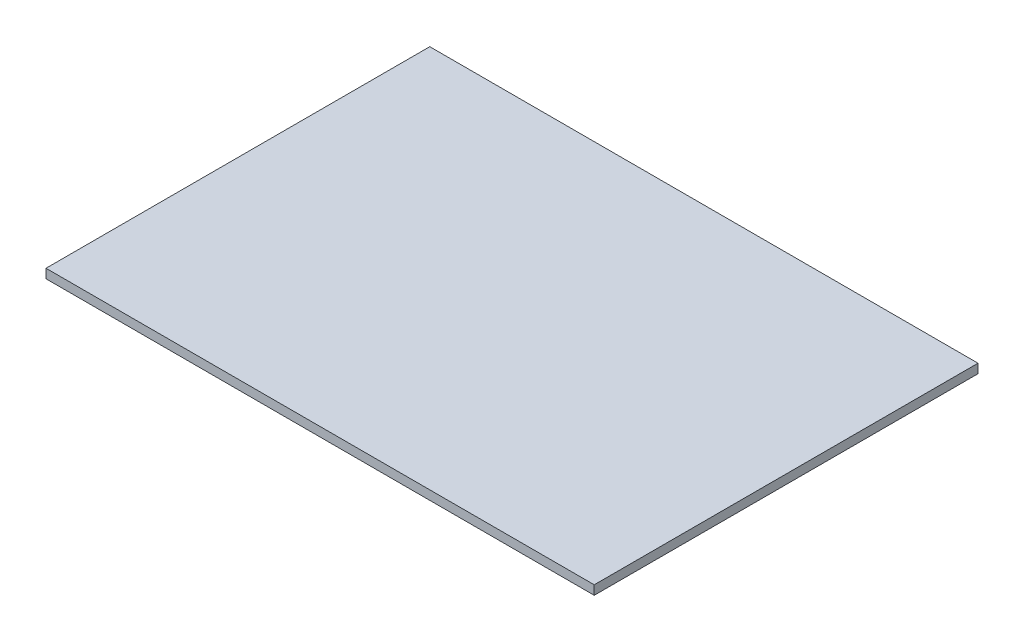
ISO-10303-21;
HEADER;
FILE_DESCRIPTION(('STEP AP214'),'2;1');
FILE_NAME('part.step','',(''),(''),'','','');
FILE_SCHEMA(('AUTOMOTIVE_DESIGN { 1 0 10303 214 1 1 1 1 }'));
ENDSEC;
DATA;
#1=APPLICATION_CONTEXT('core data for automotive mechanical design processes');
#2=APPLICATION_PROTOCOL_DEFINITION('international standard','automotive_design',2000,#1);
#3=PRODUCT_CONTEXT('',#1,'mechanical');
#4=PRODUCT('Part','Part','',(#3));
#5=PRODUCT_RELATED_PRODUCT_CATEGORY('part','',(#4));
#6=PRODUCT_DEFINITION_FORMATION('','',#4);
#7=PRODUCT_DEFINITION_CONTEXT('part definition',#1,'design');
#8=PRODUCT_DEFINITION('design','',#6,#7);
#9=PRODUCT_DEFINITION_SHAPE('','',#8);
#10=(LENGTH_UNIT() NAMED_UNIT(*) SI_UNIT(.MILLI.,.METRE.));
#11=(NAMED_UNIT(*) PLANE_ANGLE_UNIT() SI_UNIT($,.RADIAN.));
#12=(NAMED_UNIT(*) SI_UNIT($,.STERADIAN.) SOLID_ANGLE_UNIT());
#13=UNCERTAINTY_MEASURE_WITH_UNIT(LENGTH_MEASURE(1.E-05),#10,'distance_accuracy_value','');
#14=(GEOMETRIC_REPRESENTATION_CONTEXT(3) GLOBAL_UNCERTAINTY_ASSIGNED_CONTEXT((#13)) GLOBAL_UNIT_ASSIGNED_CONTEXT((#10,
#11,#12)) REPRESENTATION_CONTEXT('',''));
#15=CARTESIAN_POINT('',(0.,0.,0.));
#16=DIRECTION('',(0.,0.,1.));
#17=DIRECTION('',(1.,0.,0.));
#18=AXIS2_PLACEMENT_3D('',#15,#16,#17);
#19=CARTESIAN_POINT('',(762.000000000003,12.7,-533.4));
#20=DIRECTION('',(-1.,0.,0.));
#21=DIRECTION('',(0.,0.,1.));
#22=AXIS2_PLACEMENT_3D('',#19,#20,#21);
#23=PLANE('',#22);
#24=DIRECTION('',(0.,0.,-1.));
#25=VECTOR('',#24,1.);
#26=CARTESIAN_POINT('',(762.000000000003,0.,-533.4));
#27=LINE('',#26,#25);
#28=CARTESIAN_POINT('',(762.000000000002,0.,0.));
#29=VERTEX_POINT('',#28);
#30=CARTESIAN_POINT('',(762.000000000003,0.,-533.4));
#31=VERTEX_POINT('',#30);
#32=EDGE_CURVE('E96',#29,#31,#27,.T.);
#33=ORIENTED_EDGE('',*,*,#32,.T.);
#34=DIRECTION('',(0.,-1.,0.));
#35=VECTOR('',#34,1.);
#36=CARTESIAN_POINT('',(762.000000000003,12.7,-533.4));
#37=LINE('',#36,#35);
#38=CARTESIAN_POINT('',(762.000000000003,12.7,-533.4));
#39=VERTEX_POINT('',#38);
#40=EDGE_CURVE('E11',#39,#31,#37,.T.);
#41=ORIENTED_EDGE('',*,*,#40,.F.);
#42=DIRECTION('',(0.,0.,-1.));
#43=VECTOR('',#42,1.);
#44=CARTESIAN_POINT('',(762.000000000003,12.7,-533.4));
#45=LINE('',#44,#43);
#46=CARTESIAN_POINT('',(762.000000000002,12.7,0.));
#47=VERTEX_POINT('',#46);
#48=EDGE_CURVE('E84',#47,#39,#45,.T.);
#49=ORIENTED_EDGE('',*,*,#48,.F.);
#50=DIRECTION('',(0.,-1.,0.));
#51=VECTOR('',#50,1.);
#52=CARTESIAN_POINT('',(762.000000000002,12.7,0.));
#53=LINE('',#52,#51);
#54=EDGE_CURVE('E92',#47,#29,#53,.T.);
#55=ORIENTED_EDGE('',*,*,#54,.T.);
#56=EDGE_LOOP('',(#33,#41,#49,#55));
#57=FACE_BOUND('',#56,.T.);
#58=ADVANCED_FACE('F33',(#57),#23,.F.);
#59=CARTESIAN_POINT('',(0.,12.7,-533.4));
#60=DIRECTION('',(0.,0.,1.));
#61=DIRECTION('',(1.,0.,0.));
#62=AXIS2_PLACEMENT_3D('',#59,#60,#61);
#63=PLANE('',#62);
#64=DIRECTION('',(-1.,0.,0.));
#65=VECTOR('',#64,1.);
#66=CARTESIAN_POINT('',(0.,0.,-533.4));
#67=LINE('',#66,#65);
#68=CARTESIAN_POINT('',(0.,0.,-533.4));
#69=VERTEX_POINT('',#68);
#70=EDGE_CURVE('E88',#31,#69,#67,.T.);
#71=ORIENTED_EDGE('',*,*,#70,.T.);
#72=DIRECTION('',(0.,-1.,0.));
#73=VECTOR('',#72,1.);
#74=CARTESIAN_POINT('',(0.,12.7,-533.4));
#75=LINE('',#74,#73);
#76=CARTESIAN_POINT('',(0.,12.7,-533.4));
#77=VERTEX_POINT('',#76);
#78=EDGE_CURVE('E41',#77,#69,#75,.T.);
#79=ORIENTED_EDGE('',*,*,#78,.F.);
#80=DIRECTION('',(-1.,0.,0.));
#81=VECTOR('',#80,1.);
#82=CARTESIAN_POINT('',(0.,12.7,-533.4));
#83=LINE('',#82,#81);
#84=EDGE_CURVE('E79',#39,#77,#83,.T.);
#85=ORIENTED_EDGE('',*,*,#84,.F.);
#86=ORIENTED_EDGE('',*,*,#40,.T.);
#87=EDGE_LOOP('',(#71,#79,#85,#86));
#88=FACE_BOUND('',#87,.T.);
#89=ADVANCED_FACE('F87',(#88),#63,.F.);
#90=CARTESIAN_POINT('',(0.,12.7,-533.4));
#91=DIRECTION('',(1.,0.,0.));
#92=DIRECTION('',(0.,0.,-1.));
#93=AXIS2_PLACEMENT_3D('',#90,#91,#92);
#94=PLANE('',#93);
#95=DIRECTION('',(0.,0.,1.));
#96=VECTOR('',#95,1.);
#97=CARTESIAN_POINT('',(0.,0.,-533.4));
#98=LINE('',#97,#96);
#99=CARTESIAN_POINT('',(0.,0.,0.));
#100=VERTEX_POINT('',#99);
#101=EDGE_CURVE('E66',#69,#100,#98,.T.);
#102=ORIENTED_EDGE('',*,*,#101,.T.);
#103=DIRECTION('',(0.,-1.,0.));
#104=VECTOR('',#103,1.);
#105=CARTESIAN_POINT('',(0.,12.7,0.));
#106=LINE('',#105,#104);
#107=CARTESIAN_POINT('',(0.,12.7,0.));
#108=VERTEX_POINT('',#107);
#109=EDGE_CURVE('E89',#108,#100,#106,.T.);
#110=ORIENTED_EDGE('',*,*,#109,.F.);
#111=DIRECTION('',(0.,0.,1.));
#112=VECTOR('',#111,1.);
#113=CARTESIAN_POINT('',(0.,12.7,-533.4));
#114=LINE('',#113,#112);
#115=EDGE_CURVE('E82',#77,#108,#114,.T.);
#116=ORIENTED_EDGE('',*,*,#115,.F.);
#117=ORIENTED_EDGE('',*,*,#78,.T.);
#118=EDGE_LOOP('',(#102,#110,#116,#117));
#119=FACE_BOUND('',#118,.T.);
#120=ADVANCED_FACE('F90',(#119),#94,.F.);
#121=CARTESIAN_POINT('',(0.,12.7,0.));
#122=DIRECTION('',(0.,0.,-1.));
#123=DIRECTION('',(-1.,0.,0.));
#124=AXIS2_PLACEMENT_3D('',#121,#122,#123);
#125=PLANE('',#124);
#126=DIRECTION('',(1.,0.,0.));
#127=VECTOR('',#126,1.);
#128=CARTESIAN_POINT('',(0.,0.,0.));
#129=LINE('',#128,#127);
#130=EDGE_CURVE('E72',#100,#29,#129,.T.);
#131=ORIENTED_EDGE('',*,*,#130,.T.);
#132=ORIENTED_EDGE('',*,*,#54,.F.);
#133=DIRECTION('',(1.,0.,0.));
#134=VECTOR('',#133,1.);
#135=CARTESIAN_POINT('',(0.,12.7,0.));
#136=LINE('',#135,#134);
#137=EDGE_CURVE('E49',#108,#47,#136,.T.);
#138=ORIENTED_EDGE('',*,*,#137,.F.);
#139=ORIENTED_EDGE('',*,*,#109,.T.);
#140=EDGE_LOOP('',(#131,#132,#138,#139));
#141=FACE_BOUND('',#140,.T.);
#142=ADVANCED_FACE('F103',(#141),#125,.F.);
#143=CARTESIAN_POINT('',(0.,12.7,0.));
#144=DIRECTION('',(0.,1.,0.));
#145=DIRECTION('',(0.,0.,1.));
#146=AXIS2_PLACEMENT_3D('',#143,#144,#145);
#147=PLANE('',#146);
#148=ORIENTED_EDGE('',*,*,#48,.T.);
#149=ORIENTED_EDGE('',*,*,#84,.T.);
#150=ORIENTED_EDGE('',*,*,#115,.T.);
#151=ORIENTED_EDGE('',*,*,#137,.T.);
#152=EDGE_LOOP('',(#148,#149,#150,#151));
#153=FACE_BOUND('',#152,.T.);
#154=ADVANCED_FACE('F80',(#153),#147,.T.);
#155=CARTESIAN_POINT('',(0.,0.,0.));
#156=DIRECTION('',(0.,1.,0.));
#157=DIRECTION('',(0.,0.,1.));
#158=AXIS2_PLACEMENT_3D('',#155,#156,#157);
#159=PLANE('',#158);
#160=ORIENTED_EDGE('',*,*,#32,.F.);
#161=ORIENTED_EDGE('',*,*,#130,.F.);
#162=ORIENTED_EDGE('',*,*,#101,.F.);
#163=ORIENTED_EDGE('',*,*,#70,.F.);
#164=EDGE_LOOP('',(#160,#161,#162,#163));
#165=FACE_BOUND('',#164,.T.);
#166=ADVANCED_FACE('F106',(#165),#159,.F.);
#167=CLOSED_SHELL('',(#58,#89,#120,#142,#154,#166));
#168=MANIFOLD_SOLID_BREP('B2',#167);
#169=ADVANCED_BREP_SHAPE_REPRESENTATION('',(#18,#168),#14);
#170=SHAPE_DEFINITION_REPRESENTATION(#9,#169);
ENDSEC;
END-ISO-10303-21;
